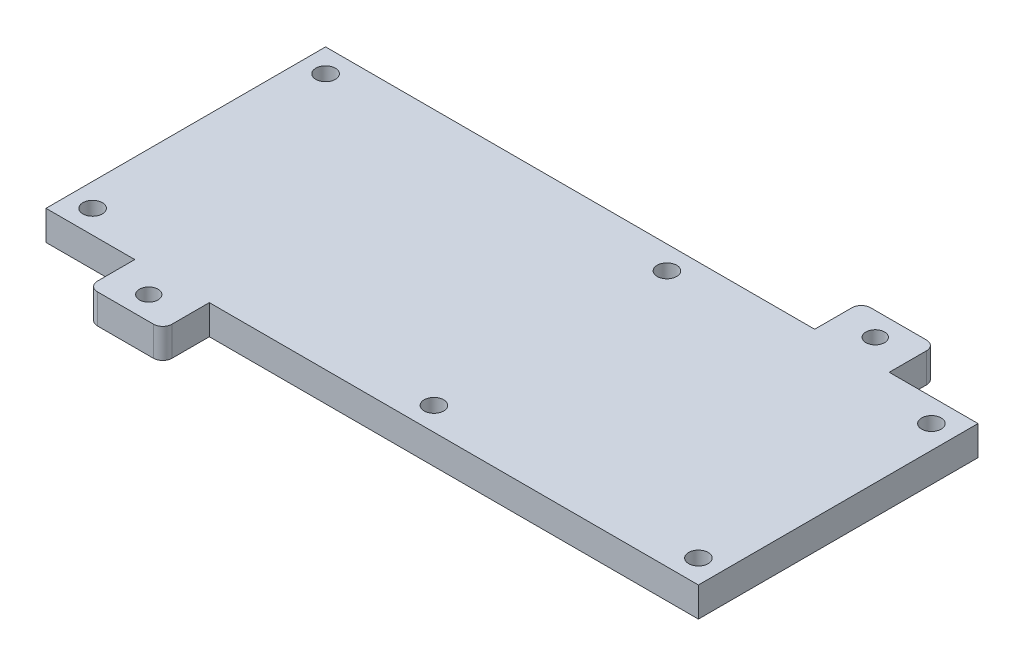
ISO-10303-21;
HEADER;
FILE_DESCRIPTION(('STEP AP214'),'2;1');
FILE_NAME('part.step','',(''),(''),'','','');
FILE_SCHEMA(('AUTOMOTIVE_DESIGN { 1 0 10303 214 1 1 1 1 }'));
ENDSEC;
DATA;
#1=APPLICATION_CONTEXT('core data for automotive mechanical design processes');
#2=APPLICATION_PROTOCOL_DEFINITION('international standard','automotive_design',2000,#1);
#3=PRODUCT_CONTEXT('',#1,'mechanical');
#4=PRODUCT('Part','Part','',(#3));
#5=PRODUCT_RELATED_PRODUCT_CATEGORY('part','',(#4));
#6=PRODUCT_DEFINITION_FORMATION('','',#4);
#7=PRODUCT_DEFINITION_CONTEXT('part definition',#1,'design');
#8=PRODUCT_DEFINITION('design','',#6,#7);
#9=PRODUCT_DEFINITION_SHAPE('','',#8);
#10=(LENGTH_UNIT() NAMED_UNIT(*) SI_UNIT(.MILLI.,.METRE.));
#11=(NAMED_UNIT(*) PLANE_ANGLE_UNIT() SI_UNIT($,.RADIAN.));
#12=(NAMED_UNIT(*) SI_UNIT($,.STERADIAN.) SOLID_ANGLE_UNIT());
#13=UNCERTAINTY_MEASURE_WITH_UNIT(LENGTH_MEASURE(1.E-05),#10,'distance_accuracy_value','');
#14=(GEOMETRIC_REPRESENTATION_CONTEXT(3) GLOBAL_UNCERTAINTY_ASSIGNED_CONTEXT((#13)) GLOBAL_UNIT_ASSIGNED_CONTEXT((#10,
#11,#12)) REPRESENTATION_CONTEXT('',''));
#15=CARTESIAN_POINT('',(0.,0.,0.));
#16=DIRECTION('',(0.,0.,1.));
#17=DIRECTION('',(1.,0.,0.));
#18=AXIS2_PLACEMENT_3D('',#15,#16,#17);
#19=CARTESIAN_POINT('',(-78.25,-6.35,30.));
#20=DIRECTION('',(0.,0.,-1.));
#21=DIRECTION('',(-1.,0.,0.));
#22=AXIS2_PLACEMENT_3D('',#19,#20,#21);
#23=PLANE('',#22);
#24=DIRECTION('',(0.,-1.,0.));
#25=VECTOR('',#24,1.);
#26=CARTESIAN_POINT('',(-59.2,0.,30.));
#27=LINE('',#26,#25);
#28=CARTESIAN_POINT('',(-59.2,0.,30.));
#29=VERTEX_POINT('',#28);
#30=CARTESIAN_POINT('',(-59.2,-6.35,30.));
#31=VERTEX_POINT('',#30);
#32=EDGE_CURVE('E160',#29,#31,#27,.T.);
#33=ORIENTED_EDGE('',*,*,#32,.F.);
#34=DIRECTION('',(-1.,0.,0.));
#35=VECTOR('',#34,1.);
#36=CARTESIAN_POINT('',(-78.25,0.,30.));
#37=LINE('',#36,#35);
#38=CARTESIAN_POINT('',(-78.25,0.,30.));
#39=VERTEX_POINT('',#38);
#40=EDGE_CURVE('E172',#29,#39,#37,.T.);
#41=ORIENTED_EDGE('',*,*,#40,.T.);
#42=DIRECTION('',(0.,1.,0.));
#43=VECTOR('',#42,1.);
#44=CARTESIAN_POINT('',(-78.25,-6.35,30.));
#45=LINE('',#44,#43);
#46=CARTESIAN_POINT('',(-78.25,-6.35,30.));
#47=VERTEX_POINT('',#46);
#48=EDGE_CURVE('E192',#47,#39,#45,.T.);
#49=ORIENTED_EDGE('',*,*,#48,.F.);
#50=DIRECTION('',(-1.,0.,0.));
#51=VECTOR('',#50,1.);
#52=CARTESIAN_POINT('',(-78.25,-6.35,30.));
#53=LINE('',#52,#51);
#54=EDGE_CURVE('E174',#31,#47,#53,.T.);
#55=ORIENTED_EDGE('',*,*,#54,.F.);
#56=EDGE_LOOP('',(#33,#41,#49,#55));
#57=FACE_BOUND('',#56,.T.);
#58=ADVANCED_FACE('F43',(#57),#23,.F.);
#59=CARTESIAN_POINT('',(-78.25,-6.35,-30.));
#60=DIRECTION('',(0.,0.,1.));
#61=DIRECTION('',(1.,0.,0.));
#62=AXIS2_PLACEMENT_3D('',#59,#60,#61);
#63=PLANE('',#62);
#64=DIRECTION('',(0.,-1.,0.));
#65=VECTOR('',#64,1.);
#66=CARTESIAN_POINT('',(42.7,0.,-30.));
#67=LINE('',#66,#65);
#68=CARTESIAN_POINT('',(42.7,0.,-30.));
#69=VERTEX_POINT('',#68);
#70=CARTESIAN_POINT('',(42.7,-6.35,-30.));
#71=VERTEX_POINT('',#70);
#72=EDGE_CURVE('E255',#69,#71,#67,.T.);
#73=ORIENTED_EDGE('',*,*,#72,.F.);
#74=DIRECTION('',(1.,0.,0.));
#75=VECTOR('',#74,1.);
#76=CARTESIAN_POINT('',(-78.25,0.,-30.));
#77=LINE('',#76,#75);
#78=CARTESIAN_POINT('',(61.75,0.,-30.));
#79=VERTEX_POINT('',#78);
#80=EDGE_CURVE('E308',#69,#79,#77,.T.);
#81=ORIENTED_EDGE('',*,*,#80,.T.);
#82=DIRECTION('',(0.,1.,0.));
#83=VECTOR('',#82,1.);
#84=CARTESIAN_POINT('',(61.75,-6.35,-30.));
#85=LINE('',#84,#83);
#86=CARTESIAN_POINT('',(61.75,-6.35,-30.));
#87=VERTEX_POINT('',#86);
#88=EDGE_CURVE('E198',#87,#79,#85,.T.);
#89=ORIENTED_EDGE('',*,*,#88,.F.);
#90=DIRECTION('',(1.,0.,0.));
#91=VECTOR('',#90,1.);
#92=CARTESIAN_POINT('',(-78.25,-6.35,-30.));
#93=LINE('',#92,#91);
#94=EDGE_CURVE('E300',#71,#87,#93,.T.);
#95=ORIENTED_EDGE('',*,*,#94,.F.);
#96=EDGE_LOOP('',(#73,#81,#89,#95));
#97=FACE_BOUND('',#96,.T.);
#98=ADVANCED_FACE('F315',(#97),#63,.F.);
#99=CARTESIAN_POINT('',(0.,-6.35,0.));
#100=DIRECTION('',(0.,-1.,0.));
#101=DIRECTION('',(0.,0.,-1.));
#102=AXIS2_PLACEMENT_3D('',#99,#100,#101);
#103=PLANE('',#102);
#104=CARTESIAN_POINT('',(0.,-6.35,-25.));
#105=DIRECTION('',(0.,-1.,0.));
#106=DIRECTION('',(0.,0.,-1.));
#107=AXIS2_PLACEMENT_3D('',#104,#105,#106);
#108=CIRCLE('',#107,2.0955);
#109=CARTESIAN_POINT('',(0.,-6.35,-27.0955));
#110=VERTEX_POINT('',#109);
#111=EDGE_CURVE('E269',#110,#110,#108,.T.);
#112=ORIENTED_EDGE('',*,*,#111,.F.);
#113=EDGE_LOOP('',(#112));
#114=FACE_BOUND('',#113,.T.);
#115=CARTESIAN_POINT('',(56.75,-6.35,25.));
#116=DIRECTION('',(0.,-1.,0.));
#117=DIRECTION('',(0.,0.,-1.));
#118=AXIS2_PLACEMENT_3D('',#115,#116,#117);
#119=CIRCLE('',#118,2.0955);
#120=CARTESIAN_POINT('',(56.75,-6.35,22.9045));
#121=VERTEX_POINT('',#120);
#122=EDGE_CURVE('E281',#121,#121,#119,.T.);
#123=ORIENTED_EDGE('',*,*,#122,.F.);
#124=EDGE_LOOP('',(#123));
#125=FACE_BOUND('',#124,.T.);
#126=CARTESIAN_POINT('',(-73.25,-6.35,25.));
#127=DIRECTION('',(0.,-1.,0.));
#128=DIRECTION('',(0.,0.,-1.));
#129=AXIS2_PLACEMENT_3D('',#126,#127,#128);
#130=CIRCLE('',#129,2.0955);
#131=CARTESIAN_POINT('',(-73.25,-6.35,22.9045));
#132=VERTEX_POINT('',#131);
#133=EDGE_CURVE('E293',#132,#132,#130,.T.);
#134=ORIENTED_EDGE('',*,*,#133,.F.);
#135=EDGE_LOOP('',(#134));
#136=FACE_BOUND('',#135,.T.);
#137=DIRECTION('',(0.,0.,1.));
#138=VECTOR('',#137,1.);
#139=CARTESIAN_POINT('',(-43.2,-6.35,0.));
#140=LINE('',#139,#138);
#141=CARTESIAN_POINT('',(-43.2000000000001,-6.35,30.));
#142=VERTEX_POINT('',#141);
#143=CARTESIAN_POINT('',(-43.2000000000001,-6.35,38.));
#144=VERTEX_POINT('',#143);
#145=EDGE_CURVE('E330',#142,#144,#140,.T.);
#146=ORIENTED_EDGE('',*,*,#145,.T.);
#147=CARTESIAN_POINT('',(-45.2000000000001,-6.35,38.));
#148=DIRECTION('',(0.,-1.,0.));
#149=DIRECTION('',(0.,0.,-1.));
#150=AXIS2_PLACEMENT_3D('',#147,#148,#149);
#151=CIRCLE('',#150,2.);
#152=CARTESIAN_POINT('',(-45.2000000000001,-6.35,40.));
#153=VERTEX_POINT('',#152);
#154=EDGE_CURVE('E213',#144,#153,#151,.T.);
#155=ORIENTED_EDGE('',*,*,#154,.T.);
#156=DIRECTION('',(1.,0.,0.));
#157=VECTOR('',#156,1.);
#158=CARTESIAN_POINT('',(0.,-6.35,40.));
#159=LINE('',#158,#157);
#160=CARTESIAN_POINT('',(-57.2,-6.35,40.));
#161=VERTEX_POINT('',#160);
#162=EDGE_CURVE('E407',#161,#153,#159,.T.);
#163=ORIENTED_EDGE('',*,*,#162,.F.);
#164=CARTESIAN_POINT('',(-57.2,-6.35,38.));
#165=DIRECTION('',(0.,-1.,0.));
#166=DIRECTION('',(0.,0.,-1.));
#167=AXIS2_PLACEMENT_3D('',#164,#165,#166);
#168=CIRCLE('',#167,2.);
#169=CARTESIAN_POINT('',(-59.2,-6.35,38.));
#170=VERTEX_POINT('',#169);
#171=EDGE_CURVE('E211',#161,#170,#168,.T.);
#172=ORIENTED_EDGE('',*,*,#171,.T.);
#173=DIRECTION('',(0.,0.,1.));
#174=VECTOR('',#173,1.);
#175=CARTESIAN_POINT('',(-59.2000000000001,-6.35,0.));
#176=LINE('',#175,#174);
#177=EDGE_CURVE('E409',#31,#170,#176,.T.);
#178=ORIENTED_EDGE('',*,*,#177,.F.);
#179=ORIENTED_EDGE('',*,*,#54,.T.);
#180=DIRECTION('',(0.,0.,-1.));
#181=VECTOR('',#180,1.);
#182=CARTESIAN_POINT('',(-78.25,-6.35,30.));
#183=LINE('',#182,#181);
#184=CARTESIAN_POINT('',(-78.25,-6.35,-30.));
#185=VERTEX_POINT('',#184);
#186=EDGE_CURVE('E187',#47,#185,#183,.T.);
#187=ORIENTED_EDGE('',*,*,#186,.T.);
#188=CARTESIAN_POINT('',(26.7,-6.35,-30.));
#189=VERTEX_POINT('',#188);
#190=EDGE_CURVE('E301',#185,#189,#93,.T.);
#191=ORIENTED_EDGE('',*,*,#190,.T.);
#192=DIRECTION('',(0.,0.,-1.));
#193=VECTOR('',#192,1.);
#194=CARTESIAN_POINT('',(26.7,-6.35,0.));
#195=LINE('',#194,#193);
#196=CARTESIAN_POINT('',(26.7,-6.35,-38.));
#197=VERTEX_POINT('',#196);
#198=EDGE_CURVE('E247',#189,#197,#195,.T.);
#199=ORIENTED_EDGE('',*,*,#198,.T.);
#200=CARTESIAN_POINT('',(28.7,-6.35,-38.));
#201=DIRECTION('',(0.,-1.,0.));
#202=DIRECTION('',(0.,0.,-1.));
#203=AXIS2_PLACEMENT_3D('',#200,#201,#202);
#204=CIRCLE('',#203,2.);
#205=CARTESIAN_POINT('',(28.7,-6.35,-40.));
#206=VERTEX_POINT('',#205);
#207=EDGE_CURVE('E209',#197,#206,#204,.T.);
#208=ORIENTED_EDGE('',*,*,#207,.T.);
#209=DIRECTION('',(-1.,0.,0.));
#210=VECTOR('',#209,1.);
#211=CARTESIAN_POINT('',(0.,-6.35,-40.));
#212=LINE('',#211,#210);
#213=CARTESIAN_POINT('',(40.7,-6.35,-40.));
#214=VERTEX_POINT('',#213);
#215=EDGE_CURVE('E236',#214,#206,#212,.T.);
#216=ORIENTED_EDGE('',*,*,#215,.F.);
#217=CARTESIAN_POINT('',(40.7,-6.35,-38.));
#218=DIRECTION('',(0.,-1.,0.));
#219=DIRECTION('',(0.,0.,-1.));
#220=AXIS2_PLACEMENT_3D('',#217,#218,#219);
#221=CIRCLE('',#220,2.);
#222=CARTESIAN_POINT('',(42.7,-6.35,-38.));
#223=VERTEX_POINT('',#222);
#224=EDGE_CURVE('E207',#214,#223,#221,.T.);
#225=ORIENTED_EDGE('',*,*,#224,.T.);
#226=DIRECTION('',(0.,0.,-1.));
#227=VECTOR('',#226,1.);
#228=CARTESIAN_POINT('',(42.7,-6.35,0.));
#229=LINE('',#228,#227);
#230=EDGE_CURVE('E246',#71,#223,#229,.T.);
#231=ORIENTED_EDGE('',*,*,#230,.F.);
#232=ORIENTED_EDGE('',*,*,#94,.T.);
#233=DIRECTION('',(0.,0.,1.));
#234=VECTOR('',#233,1.);
#235=CARTESIAN_POINT('',(61.75,-6.35,30.));
#236=LINE('',#235,#234);
#237=CARTESIAN_POINT('',(61.75,-6.35,30.));
#238=VERTEX_POINT('',#237);
#239=EDGE_CURVE('E304',#87,#238,#236,.T.);
#240=ORIENTED_EDGE('',*,*,#239,.T.);
#241=EDGE_CURVE('E195',#238,#142,#53,.T.);
#242=ORIENTED_EDGE('',*,*,#241,.T.);
#243=EDGE_LOOP('',(#146,#155,#163,#172,#178,#179,#187,#191,#199,#208,#216,#225,#231,#232,#240,#242));
#244=FACE_BOUND('',#243,.T.);
#245=CARTESIAN_POINT('',(0.,-6.35,25.));
#246=DIRECTION('',(0.,-1.,0.));
#247=DIRECTION('',(0.,0.,-1.));
#248=AXIS2_PLACEMENT_3D('',#245,#246,#247);
#249=CIRCLE('',#248,2.0955);
#250=CARTESIAN_POINT('',(0.,-6.35,22.9045));
#251=VERTEX_POINT('',#250);
#252=EDGE_CURVE('E287',#251,#251,#249,.T.);
#253=ORIENTED_EDGE('',*,*,#252,.F.);
#254=EDGE_LOOP('',(#253));
#255=FACE_BOUND('',#254,.T.);
#256=CARTESIAN_POINT('',(56.75,-6.35,-25.));
#257=DIRECTION('',(0.,-1.,0.));
#258=DIRECTION('',(0.,0.,-1.));
#259=AXIS2_PLACEMENT_3D('',#256,#257,#258);
#260=CIRCLE('',#259,2.0955);
#261=CARTESIAN_POINT('',(56.75,-6.35,-27.0955));
#262=VERTEX_POINT('',#261);
#263=EDGE_CURVE('E275',#262,#262,#260,.T.);
#264=ORIENTED_EDGE('',*,*,#263,.F.);
#265=EDGE_LOOP('',(#264));
#266=FACE_BOUND('',#265,.T.);
#267=CARTESIAN_POINT('',(-73.25,-6.35,-25.));
#268=DIRECTION('',(0.,-1.,0.));
#269=DIRECTION('',(0.,0.,-1.));
#270=AXIS2_PLACEMENT_3D('',#267,#268,#269);
#271=CIRCLE('',#270,2.0955);
#272=CARTESIAN_POINT('',(-73.25,-6.35,-27.0955));
#273=VERTEX_POINT('',#272);
#274=EDGE_CURVE('E263',#273,#273,#271,.T.);
#275=ORIENTED_EDGE('',*,*,#274,.F.);
#276=EDGE_LOOP('',(#275));
#277=FACE_BOUND('',#276,.T.);
#278=CARTESIAN_POINT('',(34.7,-6.35,-35.));
#279=DIRECTION('',(0.,-1.,0.));
#280=DIRECTION('',(0.,0.,-1.));
#281=AXIS2_PLACEMENT_3D('',#278,#279,#280);
#282=CIRCLE('',#281,2.);
#283=CARTESIAN_POINT('',(34.7,-6.35,-37.));
#284=VERTEX_POINT('',#283);
#285=EDGE_CURVE('E251',#284,#284,#282,.T.);
#286=ORIENTED_EDGE('',*,*,#285,.F.);
#287=EDGE_LOOP('',(#286));
#288=FACE_BOUND('',#287,.T.);
#289=CARTESIAN_POINT('',(-51.2,-6.35,35.));
#290=DIRECTION('',(0.,-1.,0.));
#291=DIRECTION('',(0.,0.,-1.));
#292=AXIS2_PLACEMENT_3D('',#289,#290,#291);
#293=CIRCLE('',#292,2.);
#294=CARTESIAN_POINT('',(-51.2,-6.35,33.));
#295=VERTEX_POINT('',#294);
#296=EDGE_CURVE('E404',#295,#295,#293,.T.);
#297=ORIENTED_EDGE('',*,*,#296,.F.);
#298=EDGE_LOOP('',(#297));
#299=FACE_BOUND('',#298,.T.);
#300=ADVANCED_FACE('F242',(#114,#125,#136,#244,#255,#266,#277,#288,#299),#103,.T.);
#301=CARTESIAN_POINT('',(0.,0.,0.));
#302=DIRECTION('',(0.,-1.,0.));
#303=DIRECTION('',(0.,0.,-1.));
#304=AXIS2_PLACEMENT_3D('',#301,#302,#303);
#305=PLANE('',#304);
#306=DIRECTION('',(1.,0.,0.));
#307=VECTOR('',#306,1.);
#308=CARTESIAN_POINT('',(0.,0.,40.));
#309=LINE('',#308,#307);
#310=CARTESIAN_POINT('',(-57.2,0.,40.));
#311=VERTEX_POINT('',#310);
#312=CARTESIAN_POINT('',(-45.2000000000001,0.,40.));
#313=VERTEX_POINT('',#312);
#314=EDGE_CURVE('E167',#311,#313,#309,.T.);
#315=ORIENTED_EDGE('',*,*,#314,.T.);
#316=CARTESIAN_POINT('',(-45.2000000000001,0.,38.));
#317=DIRECTION('',(0.,-1.,0.));
#318=DIRECTION('',(0.,0.,-1.));
#319=AXIS2_PLACEMENT_3D('',#316,#317,#318);
#320=CIRCLE('',#319,2.);
#321=CARTESIAN_POINT('',(-43.2000000000001,0.,38.));
#322=VERTEX_POINT('',#321);
#323=EDGE_CURVE('E225',#313,#322,#320,.F.);
#324=ORIENTED_EDGE('',*,*,#323,.T.);
#325=DIRECTION('',(0.,0.,1.));
#326=VECTOR('',#325,1.);
#327=CARTESIAN_POINT('',(-43.2,0.,0.));
#328=LINE('',#327,#326);
#329=CARTESIAN_POINT('',(-43.2000000000001,0.,30.));
#330=VERTEX_POINT('',#329);
#331=EDGE_CURVE('E166',#330,#322,#328,.T.);
#332=ORIENTED_EDGE('',*,*,#331,.F.);
#333=CARTESIAN_POINT('',(61.75,0.,30.));
#334=VERTEX_POINT('',#333);
#335=EDGE_CURVE('E183',#334,#330,#37,.T.);
#336=ORIENTED_EDGE('',*,*,#335,.F.);
#337=DIRECTION('',(0.,0.,1.));
#338=VECTOR('',#337,1.);
#339=CARTESIAN_POINT('',(61.75,0.,30.));
#340=LINE('',#339,#338);
#341=EDGE_CURVE('E184',#79,#334,#340,.T.);
#342=ORIENTED_EDGE('',*,*,#341,.F.);
#343=ORIENTED_EDGE('',*,*,#80,.F.);
#344=DIRECTION('',(0.,0.,-1.));
#345=VECTOR('',#344,1.);
#346=CARTESIAN_POINT('',(42.7,0.,0.));
#347=LINE('',#346,#345);
#348=CARTESIAN_POINT('',(42.7,0.,-38.));
#349=VERTEX_POINT('',#348);
#350=EDGE_CURVE('E262',#69,#349,#347,.T.);
#351=ORIENTED_EDGE('',*,*,#350,.T.);
#352=CARTESIAN_POINT('',(40.7,0.,-38.));
#353=DIRECTION('',(0.,-1.,0.));
#354=DIRECTION('',(0.,0.,-1.));
#355=AXIS2_PLACEMENT_3D('',#352,#353,#354);
#356=CIRCLE('',#355,2.);
#357=CARTESIAN_POINT('',(40.7,0.,-40.));
#358=VERTEX_POINT('',#357);
#359=EDGE_CURVE('E220',#349,#358,#356,.F.);
#360=ORIENTED_EDGE('',*,*,#359,.T.);
#361=DIRECTION('',(-1.,0.,0.));
#362=VECTOR('',#361,1.);
#363=CARTESIAN_POINT('',(0.,0.,-40.));
#364=LINE('',#363,#362);
#365=CARTESIAN_POINT('',(28.7,0.,-40.));
#366=VERTEX_POINT('',#365);
#367=EDGE_CURVE('E237',#358,#366,#364,.T.);
#368=ORIENTED_EDGE('',*,*,#367,.T.);
#369=CARTESIAN_POINT('',(28.7,0.,-38.));
#370=DIRECTION('',(0.,-1.,0.));
#371=DIRECTION('',(0.,0.,-1.));
#372=AXIS2_PLACEMENT_3D('',#369,#370,#371);
#373=CIRCLE('',#372,2.);
#374=CARTESIAN_POINT('',(26.7,0.,-38.));
#375=VERTEX_POINT('',#374);
#376=EDGE_CURVE('E58',#366,#375,#373,.F.);
#377=ORIENTED_EDGE('',*,*,#376,.T.);
#378=DIRECTION('',(0.,0.,-1.));
#379=VECTOR('',#378,1.);
#380=CARTESIAN_POINT('',(26.7,0.,0.));
#381=LINE('',#380,#379);
#382=CARTESIAN_POINT('',(26.7,0.,-30.));
#383=VERTEX_POINT('',#382);
#384=EDGE_CURVE('E335',#383,#375,#381,.T.);
#385=ORIENTED_EDGE('',*,*,#384,.F.);
#386=CARTESIAN_POINT('',(-78.25,0.,-30.));
#387=VERTEX_POINT('',#386);
#388=EDGE_CURVE('E188',#387,#383,#77,.T.);
#389=ORIENTED_EDGE('',*,*,#388,.F.);
#390=DIRECTION('',(0.,0.,-1.));
#391=VECTOR('',#390,1.);
#392=CARTESIAN_POINT('',(-78.25,0.,30.));
#393=LINE('',#392,#391);
#394=EDGE_CURVE('E182',#39,#387,#393,.T.);
#395=ORIENTED_EDGE('',*,*,#394,.F.);
#396=ORIENTED_EDGE('',*,*,#40,.F.);
#397=DIRECTION('',(0.,0.,1.));
#398=VECTOR('',#397,1.);
#399=CARTESIAN_POINT('',(-59.2000000000001,0.,0.));
#400=LINE('',#399,#398);
#401=CARTESIAN_POINT('',(-59.2,0.,38.));
#402=VERTEX_POINT('',#401);
#403=EDGE_CURVE('E156',#29,#402,#400,.T.);
#404=ORIENTED_EDGE('',*,*,#403,.T.);
#405=CARTESIAN_POINT('',(-57.2,0.,38.));
#406=DIRECTION('',(0.,-1.,0.));
#407=DIRECTION('',(0.,0.,-1.));
#408=AXIS2_PLACEMENT_3D('',#405,#406,#407);
#409=CIRCLE('',#408,2.);
#410=EDGE_CURVE('E223',#402,#311,#409,.F.);
#411=ORIENTED_EDGE('',*,*,#410,.T.);
#412=EDGE_LOOP('',(#315,#324,#332,#336,#342,#343,#351,#360,#368,#377,#385,#389,#395,#396,#404,#411));
#413=FACE_BOUND('',#412,.T.);
#414=CARTESIAN_POINT('',(-73.25,0.,25.));
#415=DIRECTION('',(0.,-1.,0.));
#416=DIRECTION('',(0.,0.,-1.));
#417=AXIS2_PLACEMENT_3D('',#414,#415,#416);
#418=CIRCLE('',#417,2.0955);
#419=CARTESIAN_POINT('',(-73.25,0.,22.9045));
#420=VERTEX_POINT('',#419);
#421=EDGE_CURVE('E290',#420,#420,#418,.T.);
#422=ORIENTED_EDGE('',*,*,#421,.T.);
#423=EDGE_LOOP('',(#422));
#424=FACE_BOUND('',#423,.T.);
#425=CARTESIAN_POINT('',(0.,0.,25.));
#426=DIRECTION('',(0.,-1.,0.));
#427=DIRECTION('',(0.,0.,-1.));
#428=AXIS2_PLACEMENT_3D('',#425,#426,#427);
#429=CIRCLE('',#428,2.0955);
#430=CARTESIAN_POINT('',(0.,0.,22.9045));
#431=VERTEX_POINT('',#430);
#432=EDGE_CURVE('E284',#431,#431,#429,.T.);
#433=ORIENTED_EDGE('',*,*,#432,.T.);
#434=EDGE_LOOP('',(#433));
#435=FACE_BOUND('',#434,.T.);
#436=CARTESIAN_POINT('',(56.75,0.,25.));
#437=DIRECTION('',(0.,-1.,0.));
#438=DIRECTION('',(0.,0.,-1.));
#439=AXIS2_PLACEMENT_3D('',#436,#437,#438);
#440=CIRCLE('',#439,2.0955);
#441=CARTESIAN_POINT('',(56.75,0.,22.9045));
#442=VERTEX_POINT('',#441);
#443=EDGE_CURVE('E278',#442,#442,#440,.T.);
#444=ORIENTED_EDGE('',*,*,#443,.T.);
#445=EDGE_LOOP('',(#444));
#446=FACE_BOUND('',#445,.T.);
#447=CARTESIAN_POINT('',(56.75,0.,-25.));
#448=DIRECTION('',(0.,-1.,0.));
#449=DIRECTION('',(0.,0.,-1.));
#450=AXIS2_PLACEMENT_3D('',#447,#448,#449);
#451=CIRCLE('',#450,2.0955);
#452=CARTESIAN_POINT('',(56.75,0.,-27.0955));
#453=VERTEX_POINT('',#452);
#454=EDGE_CURVE('E272',#453,#453,#451,.T.);
#455=ORIENTED_EDGE('',*,*,#454,.T.);
#456=EDGE_LOOP('',(#455));
#457=FACE_BOUND('',#456,.T.);
#458=CARTESIAN_POINT('',(0.,0.,-25.));
#459=DIRECTION('',(0.,-1.,0.));
#460=DIRECTION('',(0.,0.,-1.));
#461=AXIS2_PLACEMENT_3D('',#458,#459,#460);
#462=CIRCLE('',#461,2.0955);
#463=CARTESIAN_POINT('',(0.,0.,-27.0955));
#464=VERTEX_POINT('',#463);
#465=EDGE_CURVE('E266',#464,#464,#462,.T.);
#466=ORIENTED_EDGE('',*,*,#465,.T.);
#467=EDGE_LOOP('',(#466));
#468=FACE_BOUND('',#467,.T.);
#469=CARTESIAN_POINT('',(-73.25,0.,-25.));
#470=DIRECTION('',(0.,-1.,0.));
#471=DIRECTION('',(0.,0.,-1.));
#472=AXIS2_PLACEMENT_3D('',#469,#470,#471);
#473=CIRCLE('',#472,2.0955);
#474=CARTESIAN_POINT('',(-73.25,0.,-27.0955));
#475=VERTEX_POINT('',#474);
#476=EDGE_CURVE('E258',#475,#475,#473,.T.);
#477=ORIENTED_EDGE('',*,*,#476,.T.);
#478=EDGE_LOOP('',(#477));
#479=FACE_BOUND('',#478,.T.);
#480=CARTESIAN_POINT('',(34.7,0.,-35.));
#481=DIRECTION('',(0.,-1.,0.));
#482=DIRECTION('',(0.,0.,-1.));
#483=AXIS2_PLACEMENT_3D('',#480,#481,#482);
#484=CIRCLE('',#483,2.);
#485=CARTESIAN_POINT('',(34.7,0.,-37.));
#486=VERTEX_POINT('',#485);
#487=EDGE_CURVE('E249',#486,#486,#484,.T.);
#488=ORIENTED_EDGE('',*,*,#487,.T.);
#489=EDGE_LOOP('',(#488));
#490=FACE_BOUND('',#489,.T.);
#491=CARTESIAN_POINT('',(-51.2,0.,35.));
#492=DIRECTION('',(0.,-1.,0.));
#493=DIRECTION('',(0.,0.,-1.));
#494=AXIS2_PLACEMENT_3D('',#491,#492,#493);
#495=CIRCLE('',#494,2.);
#496=CARTESIAN_POINT('',(-51.2,0.,33.));
#497=VERTEX_POINT('',#496);
#498=EDGE_CURVE('E410',#497,#497,#495,.T.);
#499=ORIENTED_EDGE('',*,*,#498,.T.);
#500=EDGE_LOOP('',(#499));
#501=FACE_BOUND('',#500,.T.);
#502=ADVANCED_FACE('F179',(#413,#424,#435,#446,#457,#468,#479,#490,#501),#305,.F.);
#503=CARTESIAN_POINT('',(-78.25,-6.35,30.));
#504=DIRECTION('',(1.,0.,0.));
#505=DIRECTION('',(0.,0.,-1.));
#506=AXIS2_PLACEMENT_3D('',#503,#504,#505);
#507=PLANE('',#506);
#508=ORIENTED_EDGE('',*,*,#394,.T.);
#509=DIRECTION('',(0.,1.,0.));
#510=VECTOR('',#509,1.);
#511=CARTESIAN_POINT('',(-78.25,-6.35,-30.));
#512=LINE('',#511,#510);
#513=EDGE_CURVE('E201',#185,#387,#512,.T.);
#514=ORIENTED_EDGE('',*,*,#513,.F.);
#515=ORIENTED_EDGE('',*,*,#186,.F.);
#516=ORIENTED_EDGE('',*,*,#48,.T.);
#517=EDGE_LOOP('',(#508,#514,#515,#516));
#518=FACE_BOUND('',#517,.T.);
#519=ADVANCED_FACE('F384',(#518),#507,.F.);
#520=ORIENTED_EDGE('',*,*,#388,.T.);
#521=DIRECTION('',(0.,-1.,0.));
#522=VECTOR('',#521,1.);
#523=CARTESIAN_POINT('',(26.7,0.,-30.));
#524=LINE('',#523,#522);
#525=EDGE_CURVE('E259',#383,#189,#524,.T.);
#526=ORIENTED_EDGE('',*,*,#525,.T.);
#527=ORIENTED_EDGE('',*,*,#190,.F.);
#528=ORIENTED_EDGE('',*,*,#513,.T.);
#529=EDGE_LOOP('',(#520,#526,#527,#528));
#530=FACE_BOUND('',#529,.T.);
#531=ADVANCED_FACE('F367',(#530),#63,.F.);
#532=CARTESIAN_POINT('',(61.75,-6.35,30.));
#533=DIRECTION('',(-1.,0.,0.));
#534=DIRECTION('',(0.,0.,1.));
#535=AXIS2_PLACEMENT_3D('',#532,#533,#534);
#536=PLANE('',#535);
#537=ORIENTED_EDGE('',*,*,#341,.T.);
#538=DIRECTION('',(0.,1.,0.));
#539=VECTOR('',#538,1.);
#540=CARTESIAN_POINT('',(61.75,-6.35,30.));
#541=LINE('',#540,#539);
#542=EDGE_CURVE('E194',#238,#334,#541,.T.);
#543=ORIENTED_EDGE('',*,*,#542,.F.);
#544=ORIENTED_EDGE('',*,*,#239,.F.);
#545=ORIENTED_EDGE('',*,*,#88,.T.);
#546=EDGE_LOOP('',(#537,#543,#544,#545));
#547=FACE_BOUND('',#546,.T.);
#548=ADVANCED_FACE('F321',(#547),#536,.F.);
#549=ORIENTED_EDGE('',*,*,#335,.T.);
#550=DIRECTION('',(0.,-1.,0.));
#551=VECTOR('',#550,1.);
#552=CARTESIAN_POINT('',(-43.2000000000001,0.,30.));
#553=LINE('',#552,#551);
#554=EDGE_CURVE('E175',#330,#142,#553,.T.);
#555=ORIENTED_EDGE('',*,*,#554,.T.);
#556=ORIENTED_EDGE('',*,*,#241,.F.);
#557=ORIENTED_EDGE('',*,*,#542,.T.);
#558=EDGE_LOOP('',(#549,#555,#556,#557));
#559=FACE_BOUND('',#558,.T.);
#560=ADVANCED_FACE('F328',(#559),#23,.F.);
#561=CARTESIAN_POINT('',(-73.25,-6.35,25.));
#562=DIRECTION('',(0.,1.,0.));
#563=DIRECTION('',(0.,0.,1.));
#564=AXIS2_PLACEMENT_3D('',#561,#562,#563);
#565=CYLINDRICAL_SURFACE('',#564,2.0955);
#566=ORIENTED_EDGE('',*,*,#133,.T.);
#567=EDGE_LOOP('',(#566));
#568=FACE_BOUND('',#567,.T.);
#569=ORIENTED_EDGE('',*,*,#421,.F.);
#570=EDGE_LOOP('',(#569));
#571=FACE_BOUND('',#570,.T.);
#572=ADVANCED_FACE('F371',(#568,#571),#565,.F.);
#573=CARTESIAN_POINT('',(0.,-6.35,25.));
#574=DIRECTION('',(0.,1.,0.));
#575=DIRECTION('',(0.,0.,1.));
#576=AXIS2_PLACEMENT_3D('',#573,#574,#575);
#577=CYLINDRICAL_SURFACE('',#576,2.0955);
#578=ORIENTED_EDGE('',*,*,#252,.T.);
#579=EDGE_LOOP('',(#578));
#580=FACE_BOUND('',#579,.T.);
#581=ORIENTED_EDGE('',*,*,#432,.F.);
#582=EDGE_LOOP('',(#581));
#583=FACE_BOUND('',#582,.T.);
#584=ADVANCED_FACE('F377',(#580,#583),#577,.F.);
#585=CARTESIAN_POINT('',(56.75,-6.35,25.));
#586=DIRECTION('',(0.,1.,0.));
#587=DIRECTION('',(0.,0.,1.));
#588=AXIS2_PLACEMENT_3D('',#585,#586,#587);
#589=CYLINDRICAL_SURFACE('',#588,2.0955);
#590=ORIENTED_EDGE('',*,*,#122,.T.);
#591=EDGE_LOOP('',(#590));
#592=FACE_BOUND('',#591,.T.);
#593=ORIENTED_EDGE('',*,*,#443,.F.);
#594=EDGE_LOOP('',(#593));
#595=FACE_BOUND('',#594,.T.);
#596=ADVANCED_FACE('F432',(#592,#595),#589,.F.);
#597=CARTESIAN_POINT('',(56.75,-6.35,-25.));
#598=DIRECTION('',(0.,1.,0.));
#599=DIRECTION('',(0.,0.,1.));
#600=AXIS2_PLACEMENT_3D('',#597,#598,#599);
#601=CYLINDRICAL_SURFACE('',#600,2.0955);
#602=ORIENTED_EDGE('',*,*,#263,.T.);
#603=EDGE_LOOP('',(#602));
#604=FACE_BOUND('',#603,.T.);
#605=ORIENTED_EDGE('',*,*,#454,.F.);
#606=EDGE_LOOP('',(#605));
#607=FACE_BOUND('',#606,.T.);
#608=ADVANCED_FACE('F436',(#604,#607),#601,.F.);
#609=CARTESIAN_POINT('',(0.,-6.35,-25.));
#610=DIRECTION('',(0.,1.,0.));
#611=DIRECTION('',(0.,0.,1.));
#612=AXIS2_PLACEMENT_3D('',#609,#610,#611);
#613=CYLINDRICAL_SURFACE('',#612,2.0955);
#614=ORIENTED_EDGE('',*,*,#111,.T.);
#615=EDGE_LOOP('',(#614));
#616=FACE_BOUND('',#615,.T.);
#617=ORIENTED_EDGE('',*,*,#465,.F.);
#618=EDGE_LOOP('',(#617));
#619=FACE_BOUND('',#618,.T.);
#620=ADVANCED_FACE('F440',(#616,#619),#613,.F.);
#621=CARTESIAN_POINT('',(-73.25,-6.35,-25.));
#622=DIRECTION('',(0.,1.,0.));
#623=DIRECTION('',(0.,0.,1.));
#624=AXIS2_PLACEMENT_3D('',#621,#622,#623);
#625=CYLINDRICAL_SURFACE('',#624,2.0955);
#626=ORIENTED_EDGE('',*,*,#274,.T.);
#627=EDGE_LOOP('',(#626));
#628=FACE_BOUND('',#627,.T.);
#629=ORIENTED_EDGE('',*,*,#476,.F.);
#630=EDGE_LOOP('',(#629));
#631=FACE_BOUND('',#630,.T.);
#632=ADVANCED_FACE('F444',(#628,#631),#625,.F.);
#633=CARTESIAN_POINT('',(42.7,0.,0.));
#634=DIRECTION('',(-1.,0.,0.));
#635=DIRECTION('',(0.,0.,1.));
#636=AXIS2_PLACEMENT_3D('',#633,#634,#635);
#637=PLANE('',#636);
#638=ORIENTED_EDGE('',*,*,#230,.T.);
#639=DIRECTION('',(0.,-1.,0.));
#640=VECTOR('',#639,1.);
#641=CARTESIAN_POINT('',(42.7,0.,-38.));
#642=LINE('',#641,#640);
#643=EDGE_CURVE('E11',#223,#349,#642,.F.);
#644=ORIENTED_EDGE('',*,*,#643,.T.);
#645=ORIENTED_EDGE('',*,*,#350,.F.);
#646=ORIENTED_EDGE('',*,*,#72,.T.);
#647=EDGE_LOOP('',(#638,#644,#645,#646));
#648=FACE_BOUND('',#647,.T.);
#649=ADVANCED_FACE('F333',(#648),#637,.F.);
#650=CARTESIAN_POINT('',(0.,0.,-40.));
#651=DIRECTION('',(0.,0.,1.));
#652=DIRECTION('',(1.,0.,0.));
#653=AXIS2_PLACEMENT_3D('',#650,#651,#652);
#654=PLANE('',#653);
#655=ORIENTED_EDGE('',*,*,#215,.T.);
#656=DIRECTION('',(0.,-1.,0.));
#657=VECTOR('',#656,1.);
#658=CARTESIAN_POINT('',(28.7,0.,-40.));
#659=LINE('',#658,#657);
#660=EDGE_CURVE('E51',#206,#366,#659,.F.);
#661=ORIENTED_EDGE('',*,*,#660,.T.);
#662=ORIENTED_EDGE('',*,*,#367,.F.);
#663=DIRECTION('',(0.,-1.,0.));
#664=VECTOR('',#663,1.);
#665=CARTESIAN_POINT('',(40.7,0.,-40.));
#666=LINE('',#665,#664);
#667=EDGE_CURVE('E231',#358,#214,#666,.T.);
#668=ORIENTED_EDGE('',*,*,#667,.T.);
#669=EDGE_LOOP('',(#655,#661,#662,#668));
#670=FACE_BOUND('',#669,.T.);
#671=ADVANCED_FACE('F235',(#670),#654,.F.);
#672=CARTESIAN_POINT('',(34.7,0.,-35.));
#673=DIRECTION('',(0.,-1.,0.));
#674=DIRECTION('',(0.,0.,-1.));
#675=AXIS2_PLACEMENT_3D('',#672,#673,#674);
#676=CYLINDRICAL_SURFACE('',#675,2.);
#677=ORIENTED_EDGE('',*,*,#487,.F.);
#678=EDGE_LOOP('',(#677));
#679=FACE_BOUND('',#678,.T.);
#680=ORIENTED_EDGE('',*,*,#285,.T.);
#681=EDGE_LOOP('',(#680));
#682=FACE_BOUND('',#681,.T.);
#683=ADVANCED_FACE('F448',(#679,#682),#676,.F.);
#684=CARTESIAN_POINT('',(26.7,0.,0.));
#685=DIRECTION('',(-1.,0.,0.));
#686=DIRECTION('',(0.,0.,1.));
#687=AXIS2_PLACEMENT_3D('',#684,#685,#686);
#688=PLANE('',#687);
#689=ORIENTED_EDGE('',*,*,#384,.T.);
#690=DIRECTION('',(0.,-1.,0.));
#691=VECTOR('',#690,1.);
#692=CARTESIAN_POINT('',(26.7,-6.35,-38.));
#693=LINE('',#692,#691);
#694=EDGE_CURVE('E228',#375,#197,#693,.T.);
#695=ORIENTED_EDGE('',*,*,#694,.T.);
#696=ORIENTED_EDGE('',*,*,#198,.F.);
#697=ORIENTED_EDGE('',*,*,#525,.F.);
#698=EDGE_LOOP('',(#689,#695,#696,#697));
#699=FACE_BOUND('',#698,.T.);
#700=ADVANCED_FACE('F348',(#699),#688,.T.);
#701=CARTESIAN_POINT('',(0.,0.,40.));
#702=DIRECTION('',(0.,0.,-1.));
#703=DIRECTION('',(-1.,0.,0.));
#704=AXIS2_PLACEMENT_3D('',#701,#702,#703);
#705=PLANE('',#704);
#706=ORIENTED_EDGE('',*,*,#162,.T.);
#707=DIRECTION('',(0.,-1.,0.));
#708=VECTOR('',#707,1.);
#709=CARTESIAN_POINT('',(-45.2000000000001,0.,40.));
#710=LINE('',#709,#708);
#711=EDGE_CURVE('E218',#153,#313,#710,.F.);
#712=ORIENTED_EDGE('',*,*,#711,.T.);
#713=ORIENTED_EDGE('',*,*,#314,.F.);
#714=DIRECTION('',(0.,-1.,0.));
#715=VECTOR('',#714,1.);
#716=CARTESIAN_POINT('',(-57.2,0.,40.));
#717=LINE('',#716,#715);
#718=EDGE_CURVE('E215',#311,#161,#717,.T.);
#719=ORIENTED_EDGE('',*,*,#718,.T.);
#720=EDGE_LOOP('',(#706,#712,#713,#719));
#721=FACE_BOUND('',#720,.T.);
#722=ADVANCED_FACE('F453',(#721),#705,.F.);
#723=CARTESIAN_POINT('',(-43.2,0.,0.));
#724=DIRECTION('',(1.,0.,0.));
#725=DIRECTION('',(0.,0.,-1.));
#726=AXIS2_PLACEMENT_3D('',#723,#724,#725);
#727=PLANE('',#726);
#728=ORIENTED_EDGE('',*,*,#331,.T.);
#729=DIRECTION('',(0.,-1.,0.));
#730=VECTOR('',#729,1.);
#731=CARTESIAN_POINT('',(-43.2000000000001,-6.35,38.));
#732=LINE('',#731,#730);
#733=EDGE_CURVE('E204',#322,#144,#732,.T.);
#734=ORIENTED_EDGE('',*,*,#733,.T.);
#735=ORIENTED_EDGE('',*,*,#145,.F.);
#736=ORIENTED_EDGE('',*,*,#554,.F.);
#737=EDGE_LOOP('',(#728,#734,#735,#736));
#738=FACE_BOUND('',#737,.T.);
#739=ADVANCED_FACE('F400',(#738),#727,.T.);
#740=CARTESIAN_POINT('',(-51.2,0.,35.));
#741=DIRECTION('',(0.,-1.,0.));
#742=DIRECTION('',(0.,0.,-1.));
#743=AXIS2_PLACEMENT_3D('',#740,#741,#742);
#744=CYLINDRICAL_SURFACE('',#743,2.);
#745=ORIENTED_EDGE('',*,*,#498,.F.);
#746=EDGE_LOOP('',(#745));
#747=FACE_BOUND('',#746,.T.);
#748=ORIENTED_EDGE('',*,*,#296,.T.);
#749=EDGE_LOOP('',(#748));
#750=FACE_BOUND('',#749,.T.);
#751=ADVANCED_FACE('F393',(#747,#750),#744,.F.);
#752=CARTESIAN_POINT('',(-59.2000000000001,0.,0.));
#753=DIRECTION('',(1.,0.,0.));
#754=DIRECTION('',(0.,0.,-1.));
#755=AXIS2_PLACEMENT_3D('',#752,#753,#754);
#756=PLANE('',#755);
#757=ORIENTED_EDGE('',*,*,#177,.T.);
#758=DIRECTION('',(0.,-1.,0.));
#759=VECTOR('',#758,1.);
#760=CARTESIAN_POINT('',(-59.2,0.,38.));
#761=LINE('',#760,#759);
#762=EDGE_CURVE('E163',#170,#402,#761,.F.);
#763=ORIENTED_EDGE('',*,*,#762,.T.);
#764=ORIENTED_EDGE('',*,*,#403,.F.);
#765=ORIENTED_EDGE('',*,*,#32,.T.);
#766=EDGE_LOOP('',(#757,#763,#764,#765));
#767=FACE_BOUND('',#766,.T.);
#768=ADVANCED_FACE('F159',(#767),#756,.F.);
#769=CARTESIAN_POINT('',(-45.2000000000001,0.,38.));
#770=DIRECTION('',(0.,1.,0.));
#771=DIRECTION('',(0.,0.,1.));
#772=AXIS2_PLACEMENT_3D('',#769,#770,#771);
#773=CYLINDRICAL_SURFACE('',#772,2.);
#774=ORIENTED_EDGE('',*,*,#323,.F.);
#775=ORIENTED_EDGE('',*,*,#711,.F.);
#776=ORIENTED_EDGE('',*,*,#154,.F.);
#777=ORIENTED_EDGE('',*,*,#733,.F.);
#778=EDGE_LOOP('',(#774,#775,#776,#777));
#779=FACE_BOUND('',#778,.T.);
#780=ADVANCED_FACE('F357',(#779),#773,.T.);
#781=CARTESIAN_POINT('',(-57.2,0.,38.));
#782=DIRECTION('',(0.,-1.,0.));
#783=DIRECTION('',(0.,0.,-1.));
#784=AXIS2_PLACEMENT_3D('',#781,#782,#783);
#785=CYLINDRICAL_SURFACE('',#784,2.);
#786=ORIENTED_EDGE('',*,*,#410,.F.);
#787=ORIENTED_EDGE('',*,*,#762,.F.);
#788=ORIENTED_EDGE('',*,*,#171,.F.);
#789=ORIENTED_EDGE('',*,*,#718,.F.);
#790=EDGE_LOOP('',(#786,#787,#788,#789));
#791=FACE_BOUND('',#790,.T.);
#792=ADVANCED_FACE('F352',(#791),#785,.T.);
#793=CARTESIAN_POINT('',(28.7,0.,-38.));
#794=DIRECTION('',(0.,1.,0.));
#795=DIRECTION('',(0.,0.,1.));
#796=AXIS2_PLACEMENT_3D('',#793,#794,#795);
#797=CYLINDRICAL_SURFACE('',#796,2.);
#798=ORIENTED_EDGE('',*,*,#376,.F.);
#799=ORIENTED_EDGE('',*,*,#660,.F.);
#800=ORIENTED_EDGE('',*,*,#207,.F.);
#801=ORIENTED_EDGE('',*,*,#694,.F.);
#802=EDGE_LOOP('',(#798,#799,#800,#801));
#803=FACE_BOUND('',#802,.T.);
#804=ADVANCED_FACE('F350',(#803),#797,.T.);
#805=CARTESIAN_POINT('',(40.7,0.,-38.));
#806=DIRECTION('',(0.,-1.,0.));
#807=DIRECTION('',(0.,0.,-1.));
#808=AXIS2_PLACEMENT_3D('',#805,#806,#807);
#809=CYLINDRICAL_SURFACE('',#808,2.);
#810=ORIENTED_EDGE('',*,*,#359,.F.);
#811=ORIENTED_EDGE('',*,*,#643,.F.);
#812=ORIENTED_EDGE('',*,*,#224,.F.);
#813=ORIENTED_EDGE('',*,*,#667,.F.);
#814=EDGE_LOOP('',(#810,#811,#812,#813));
#815=FACE_BOUND('',#814,.T.);
#816=ADVANCED_FACE('F45',(#815),#809,.T.);
#817=CLOSED_SHELL('',(#58,#98,#300,#502,#519,#531,#548,#560,#572,#584,#596,#608,#620,#632,#649,
#671,#683,#700,#722,#739,#751,#768,#780,#792,#804,#816));
#818=MANIFOLD_SOLID_BREP('B2',#817);
#819=ADVANCED_BREP_SHAPE_REPRESENTATION('',(#18,#818),#14);
#820=SHAPE_DEFINITION_REPRESENTATION(#9,#819);
ENDSEC;
END-ISO-10303-21;
